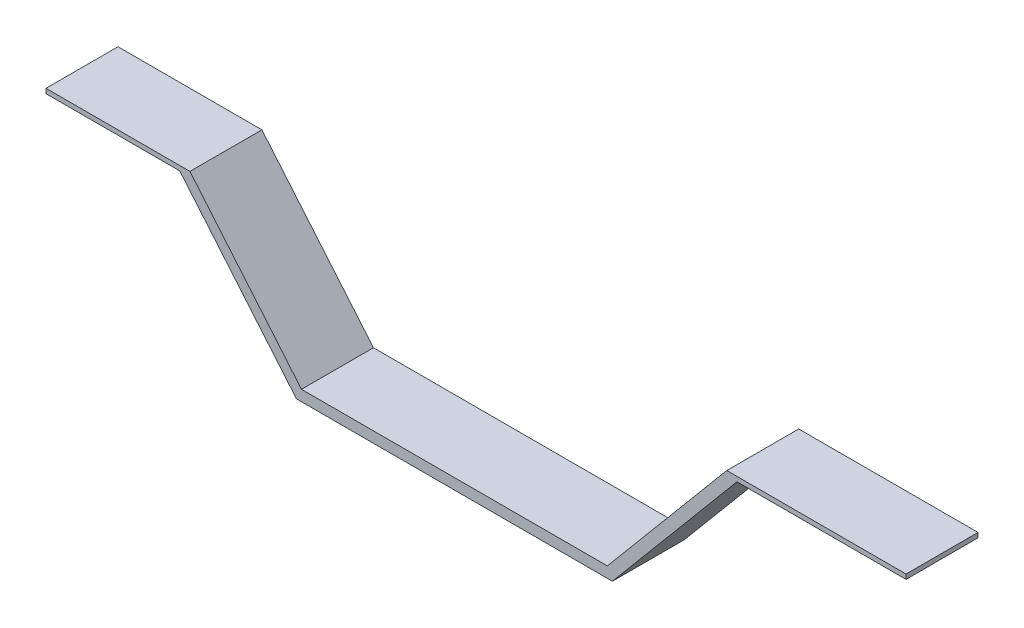
ISO-10303-21;
HEADER;
FILE_DESCRIPTION(('STEP AP214'),'2;1');
FILE_NAME('part.step','',(''),(''),'','','');
FILE_SCHEMA(('AUTOMOTIVE_DESIGN { 1 0 10303 214 1 1 1 1 }'));
ENDSEC;
DATA;
#1=APPLICATION_CONTEXT('core data for automotive mechanical design processes');
#2=APPLICATION_PROTOCOL_DEFINITION('international standard','automotive_design',2000,#1);
#3=PRODUCT_CONTEXT('',#1,'mechanical');
#4=PRODUCT('Part','Part','',(#3));
#5=PRODUCT_RELATED_PRODUCT_CATEGORY('part','',(#4));
#6=PRODUCT_DEFINITION_FORMATION('','',#4);
#7=PRODUCT_DEFINITION_CONTEXT('part definition',#1,'design');
#8=PRODUCT_DEFINITION('design','',#6,#7);
#9=PRODUCT_DEFINITION_SHAPE('','',#8);
#10=(LENGTH_UNIT() NAMED_UNIT(*) SI_UNIT(.MILLI.,.METRE.));
#11=(NAMED_UNIT(*) PLANE_ANGLE_UNIT() SI_UNIT($,.RADIAN.));
#12=(NAMED_UNIT(*) SI_UNIT($,.STERADIAN.) SOLID_ANGLE_UNIT());
#13=UNCERTAINTY_MEASURE_WITH_UNIT(LENGTH_MEASURE(1.E-05),#10,'distance_accuracy_value','');
#14=(GEOMETRIC_REPRESENTATION_CONTEXT(3) GLOBAL_UNCERTAINTY_ASSIGNED_CONTEXT((#13)) GLOBAL_UNIT_ASSIGNED_CONTEXT((#10,
#11,#12)) REPRESENTATION_CONTEXT('',''));
#15=CARTESIAN_POINT('',(0.,0.,0.));
#16=DIRECTION('',(0.,0.,1.));
#17=DIRECTION('',(1.,0.,0.));
#18=AXIS2_PLACEMENT_3D('',#15,#16,#17);
#19=CARTESIAN_POINT('',(-176.925616004308,29.5889707372712,20.));
#20=DIRECTION('',(1.,0.,0.));
#21=DIRECTION('',(0.,0.,-1.));
#22=AXIS2_PLACEMENT_3D('',#19,#20,#21);
#23=PLANE('',#22);
#24=DIRECTION('',(0.,-1.,0.));
#25=VECTOR('',#24,1.);
#26=CARTESIAN_POINT('',(-176.925616004308,29.5889707372712,0.));
#27=LINE('',#26,#25);
#28=CARTESIAN_POINT('',(-176.925616004308,29.5889707372712,0.));
#29=VERTEX_POINT('',#28);
#30=CARTESIAN_POINT('',(-176.925616004308,28.2889707372712,0.));
#31=VERTEX_POINT('',#30);
#32=EDGE_CURVE('E153',#29,#31,#27,.T.);
#33=ORIENTED_EDGE('',*,*,#32,.T.);
#34=DIRECTION('',(0.,0.,-1.));
#35=VECTOR('',#34,1.);
#36=CARTESIAN_POINT('',(-176.925616004308,28.2889707372712,20.));
#37=LINE('',#36,#35);
#38=CARTESIAN_POINT('',(-176.925616004308,28.2889707372712,20.));
#39=VERTEX_POINT('',#38);
#40=EDGE_CURVE('E11',#39,#31,#37,.T.);
#41=ORIENTED_EDGE('',*,*,#40,.F.);
#42=DIRECTION('',(0.,-1.,0.));
#43=VECTOR('',#42,1.);
#44=CARTESIAN_POINT('',(-176.925616004308,29.5889707372712,20.));
#45=LINE('',#44,#43);
#46=CARTESIAN_POINT('',(-176.925616004308,29.5889707372712,20.));
#47=VERTEX_POINT('',#46);
#48=EDGE_CURVE('E175',#47,#39,#45,.T.);
#49=ORIENTED_EDGE('',*,*,#48,.F.);
#50=DIRECTION('',(0.,0.,-1.));
#51=VECTOR('',#50,1.);
#52=CARTESIAN_POINT('',(-176.925616004308,29.5889707372712,20.));
#53=LINE('',#52,#51);
#54=EDGE_CURVE('E149',#47,#29,#53,.T.);
#55=ORIENTED_EDGE('',*,*,#54,.T.);
#56=EDGE_LOOP('',(#33,#41,#49,#55));
#57=FACE_BOUND('',#56,.T.);
#58=ADVANCED_FACE('F33',(#57),#23,.F.);
#59=CARTESIAN_POINT('',(-176.925616004308,28.2889707372712,20.));
#60=DIRECTION('',(0.,1.,0.));
#61=DIRECTION('',(0.,0.,1.));
#62=AXIS2_PLACEMENT_3D('',#59,#60,#61);
#63=PLANE('',#62);
#64=DIRECTION('',(1.,0.,0.));
#65=VECTOR('',#64,1.);
#66=CARTESIAN_POINT('',(-176.925616004308,28.2889707372712,0.));
#67=LINE('',#66,#65);
#68=CARTESIAN_POINT('',(-139.751008351775,28.2889707372712,0.));
#69=VERTEX_POINT('',#68);
#70=EDGE_CURVE('E156',#31,#69,#67,.T.);
#71=ORIENTED_EDGE('',*,*,#70,.T.);
#72=DIRECTION('',(0.,0.,-1.));
#73=VECTOR('',#72,1.);
#74=CARTESIAN_POINT('',(-139.751008351775,28.2889707372712,20.));
#75=LINE('',#74,#73);
#76=CARTESIAN_POINT('',(-139.751008351775,28.2889707372712,20.));
#77=VERTEX_POINT('',#76);
#78=EDGE_CURVE('E41',#77,#69,#75,.T.);
#79=ORIENTED_EDGE('',*,*,#78,.F.);
#80=DIRECTION('',(1.,0.,0.));
#81=VECTOR('',#80,1.);
#82=CARTESIAN_POINT('',(-176.925616004308,28.2889707372712,20.));
#83=LINE('',#82,#81);
#84=EDGE_CURVE('E104',#39,#77,#83,.T.);
#85=ORIENTED_EDGE('',*,*,#84,.F.);
#86=ORIENTED_EDGE('',*,*,#40,.T.);
#87=EDGE_LOOP('',(#71,#79,#85,#86));
#88=FACE_BOUND('',#87,.T.);
#89=ADVANCED_FACE('F253',(#88),#63,.F.);
#90=CARTESIAN_POINT('',(-139.751008351775,28.2889707372712,20.));
#91=DIRECTION('',(0.766044443118979,0.642787609686538,0.));
#92=DIRECTION('',(-0.642787609686538,0.766044443118979,0.));
#93=AXIS2_PLACEMENT_3D('',#90,#91,#92);
#94=PLANE('',#93);
#95=DIRECTION('',(0.642787609686538,-0.766044443118979,0.));
#96=VECTOR('',#95,1.);
#97=CARTESIAN_POINT('',(-139.751008351775,28.2889707372712,0.));
#98=LINE('',#97,#96);
#99=CARTESIAN_POINT('',(-107.324538978773,-10.3553906331496,0.));
#100=VERTEX_POINT('',#99);
#101=EDGE_CURVE('E158',#69,#100,#98,.T.);
#102=ORIENTED_EDGE('',*,*,#101,.T.);
#103=DIRECTION('',(0.,0.,-1.));
#104=VECTOR('',#103,1.);
#105=CARTESIAN_POINT('',(-107.324538978773,-10.3553906331496,20.));
#106=LINE('',#105,#104);
#107=CARTESIAN_POINT('',(-107.324538978773,-10.3553906331496,20.));
#108=VERTEX_POINT('',#107);
#109=EDGE_CURVE('E194',#108,#100,#106,.T.);
#110=ORIENTED_EDGE('',*,*,#109,.F.);
#111=DIRECTION('',(0.642787609686538,-0.766044443118979,0.));
#112=VECTOR('',#111,1.);
#113=CARTESIAN_POINT('',(-139.751008351775,28.2889707372712,20.));
#114=LINE('',#113,#112);
#115=EDGE_CURVE('E202',#77,#108,#114,.T.);
#116=ORIENTED_EDGE('',*,*,#115,.F.);
#117=ORIENTED_EDGE('',*,*,#78,.T.);
#118=EDGE_LOOP('',(#102,#110,#116,#117));
#119=FACE_BOUND('',#118,.T.);
#120=ADVANCED_FACE('F200',(#119),#94,.F.);
#121=CARTESIAN_POINT('',(-107.324538978773,-10.3553906331496,20.));
#122=DIRECTION('',(0.,1.,0.));
#123=DIRECTION('',(0.,0.,1.));
#124=AXIS2_PLACEMENT_3D('',#121,#122,#123);
#125=PLANE('',#124);
#126=DIRECTION('',(1.,0.,0.));
#127=VECTOR('',#126,1.);
#128=CARTESIAN_POINT('',(-107.324538978773,-10.3553906331496,0.));
#129=LINE('',#128,#127);
#130=CARTESIAN_POINT('',(-19.5266930298433,-10.3553906331496,0.));
#131=VERTEX_POINT('',#130);
#132=EDGE_CURVE('E160',#100,#131,#129,.T.);
#133=ORIENTED_EDGE('',*,*,#132,.T.);
#134=DIRECTION('',(0.,0.,-1.));
#135=VECTOR('',#134,1.);
#136=CARTESIAN_POINT('',(-19.5266930298433,-10.3553906331496,20.));
#137=LINE('',#136,#135);
#138=CARTESIAN_POINT('',(-19.5266930298433,-10.3553906331496,20.));
#139=VERTEX_POINT('',#138);
#140=EDGE_CURVE('E191',#139,#131,#137,.T.);
#141=ORIENTED_EDGE('',*,*,#140,.F.);
#142=DIRECTION('',(1.,0.,0.));
#143=VECTOR('',#142,1.);
#144=CARTESIAN_POINT('',(-107.324538978773,-10.3553906331496,20.));
#145=LINE('',#144,#143);
#146=EDGE_CURVE('E220',#108,#139,#145,.T.);
#147=ORIENTED_EDGE('',*,*,#146,.F.);
#148=ORIENTED_EDGE('',*,*,#109,.T.);
#149=EDGE_LOOP('',(#133,#141,#147,#148));
#150=FACE_BOUND('',#149,.T.);
#151=ADVANCED_FACE('F211',(#150),#125,.F.);
#152=CARTESIAN_POINT('',(-19.5266930298433,-10.3553906331496,20.));
#153=DIRECTION('',(-0.766044443118976,0.642787609686542,0.));
#154=DIRECTION('',(-0.642787609686542,-0.766044443118976,0.));
#155=AXIS2_PLACEMENT_3D('',#152,#153,#154);
#156=PLANE('',#155);
#157=DIRECTION('',(0.642787609686542,0.766044443118976,0.));
#158=VECTOR('',#157,1.);
#159=CARTESIAN_POINT('',(-19.5266930298433,-10.3553906331496,0.));
#160=LINE('',#159,#158);
#161=CARTESIAN_POINT('',(15.0850193793813,30.8932419763812,0.));
#162=VERTEX_POINT('',#161);
#163=EDGE_CURVE('E162',#131,#162,#160,.T.);
#164=ORIENTED_EDGE('',*,*,#163,.T.);
#165=DIRECTION('',(0.,0.,-1.));
#166=VECTOR('',#165,1.);
#167=CARTESIAN_POINT('',(15.0850193793813,30.8932419763812,20.));
#168=LINE('',#167,#166);
#169=CARTESIAN_POINT('',(15.0850193793813,30.8932419763812,20.));
#170=VERTEX_POINT('',#169);
#171=EDGE_CURVE('E188',#170,#162,#168,.T.);
#172=ORIENTED_EDGE('',*,*,#171,.F.);
#173=DIRECTION('',(0.642787609686542,0.766044443118976,0.));
#174=VECTOR('',#173,1.);
#175=CARTESIAN_POINT('',(-19.5266930298433,-10.3553906331496,20.));
#176=LINE('',#175,#174);
#177=EDGE_CURVE('E217',#139,#170,#176,.T.);
#178=ORIENTED_EDGE('',*,*,#177,.F.);
#179=ORIENTED_EDGE('',*,*,#140,.T.);
#180=EDGE_LOOP('',(#164,#172,#178,#179));
#181=FACE_BOUND('',#180,.T.);
#182=ADVANCED_FACE('F215',(#181),#156,.F.);
#183=CARTESIAN_POINT('',(62.0743839956915,30.8932419763812,20.));
#184=DIRECTION('',(0.,1.,0.));
#185=DIRECTION('',(0.,0.,1.));
#186=AXIS2_PLACEMENT_3D('',#183,#184,#185);
#187=PLANE('',#186);
#188=DIRECTION('',(1.,0.,0.));
#189=VECTOR('',#188,1.);
#190=CARTESIAN_POINT('',(62.0743839956915,30.8932419763812,0.));
#191=LINE('',#190,#189);
#192=CARTESIAN_POINT('',(62.0743839956915,30.8932419763812,0.));
#193=VERTEX_POINT('',#192);
#194=EDGE_CURVE('E164',#162,#193,#191,.T.);
#195=ORIENTED_EDGE('',*,*,#194,.T.);
#196=DIRECTION('',(0.,0.,-1.));
#197=VECTOR('',#196,1.);
#198=CARTESIAN_POINT('',(62.0743839956915,30.8932419763812,20.));
#199=LINE('',#198,#197);
#200=CARTESIAN_POINT('',(62.0743839956915,30.8932419763812,20.));
#201=VERTEX_POINT('',#200);
#202=EDGE_CURVE('E185',#201,#193,#199,.T.);
#203=ORIENTED_EDGE('',*,*,#202,.F.);
#204=DIRECTION('',(1.,0.,0.));
#205=VECTOR('',#204,1.);
#206=CARTESIAN_POINT('',(62.0743839956915,30.8932419763812,20.));
#207=LINE('',#206,#205);
#208=EDGE_CURVE('E219',#170,#201,#207,.T.);
#209=ORIENTED_EDGE('',*,*,#208,.F.);
#210=ORIENTED_EDGE('',*,*,#171,.T.);
#211=EDGE_LOOP('',(#195,#203,#209,#210));
#212=FACE_BOUND('',#211,.T.);
#213=ADVANCED_FACE('F266',(#212),#187,.F.);
#214=CARTESIAN_POINT('',(62.0743839956915,32.1932419763812,20.));
#215=DIRECTION('',(-1.,0.,0.));
#216=DIRECTION('',(0.,0.,1.));
#217=AXIS2_PLACEMENT_3D('',#214,#215,#216);
#218=PLANE('',#217);
#219=DIRECTION('',(0.,1.,0.));
#220=VECTOR('',#219,1.);
#221=CARTESIAN_POINT('',(62.0743839956915,32.1932419763812,0.));
#222=LINE('',#221,#220);
#223=CARTESIAN_POINT('',(62.0743839956915,32.1932419763812,0.));
#224=VERTEX_POINT('',#223);
#225=EDGE_CURVE('E166',#193,#224,#222,.T.);
#226=ORIENTED_EDGE('',*,*,#225,.T.);
#227=DIRECTION('',(0.,0.,-1.));
#228=VECTOR('',#227,1.);
#229=CARTESIAN_POINT('',(62.0743839956915,32.1932419763812,20.));
#230=LINE('',#229,#228);
#231=CARTESIAN_POINT('',(62.0743839956915,32.1932419763812,20.));
#232=VERTEX_POINT('',#231);
#233=EDGE_CURVE('E182',#232,#224,#230,.T.);
#234=ORIENTED_EDGE('',*,*,#233,.F.);
#235=DIRECTION('',(0.,1.,0.));
#236=VECTOR('',#235,1.);
#237=CARTESIAN_POINT('',(62.0743839956915,32.1932419763812,20.));
#238=LINE('',#237,#236);
#239=EDGE_CURVE('E222',#201,#232,#238,.T.);
#240=ORIENTED_EDGE('',*,*,#239,.F.);
#241=ORIENTED_EDGE('',*,*,#202,.T.);
#242=EDGE_LOOP('',(#226,#234,#240,#241));
#243=FACE_BOUND('',#242,.T.);
#244=ADVANCED_FACE('F269',(#243),#218,.F.);
#245=CARTESIAN_POINT('',(62.0743839956915,32.1932419763812,20.));
#246=DIRECTION('',(0.,-1.,0.));
#247=DIRECTION('',(0.,0.,-1.));
#248=AXIS2_PLACEMENT_3D('',#245,#246,#247);
#249=PLANE('',#248);
#250=DIRECTION('',(-1.,0.,0.));
#251=VECTOR('',#250,1.);
#252=CARTESIAN_POINT('',(62.0743839956915,32.1932419763812,0.));
#253=LINE('',#252,#251);
#254=CARTESIAN_POINT('',(12.2596270319149,32.1932419763812,0.));
#255=VERTEX_POINT('',#254);
#256=EDGE_CURVE('E168',#224,#255,#253,.T.);
#257=ORIENTED_EDGE('',*,*,#256,.T.);
#258=DIRECTION('',(0.,0.,-1.));
#259=VECTOR('',#258,1.);
#260=CARTESIAN_POINT('',(12.2596270319149,32.1932419763812,20.));
#261=LINE('',#260,#259);
#262=CARTESIAN_POINT('',(12.2596270319149,32.1932419763812,20.));
#263=VERTEX_POINT('',#262);
#264=EDGE_CURVE('E179',#263,#255,#261,.T.);
#265=ORIENTED_EDGE('',*,*,#264,.F.);
#266=DIRECTION('',(-1.,0.,0.));
#267=VECTOR('',#266,1.);
#268=CARTESIAN_POINT('',(62.0743839956915,32.1932419763812,20.));
#269=LINE('',#268,#267);
#270=EDGE_CURVE('E228',#232,#263,#269,.T.);
#271=ORIENTED_EDGE('',*,*,#270,.F.);
#272=ORIENTED_EDGE('',*,*,#233,.T.);
#273=EDGE_LOOP('',(#257,#265,#271,#272));
#274=FACE_BOUND('',#273,.T.);
#275=ADVANCED_FACE('F234',(#274),#249,.F.);
#276=CARTESIAN_POINT('',(-20.9256160043083,-7.35539063314961,20.));
#277=DIRECTION('',(0.766044443118976,-0.642787609686542,0.));
#278=DIRECTION('',(0.642787609686542,0.766044443118976,0.));
#279=AXIS2_PLACEMENT_3D('',#276,#277,#278);
#280=PLANE('',#279);
#281=DIRECTION('',(-0.642787609686542,-0.766044443118976,0.));
#282=VECTOR('',#281,1.);
#283=CARTESIAN_POINT('',(-20.9256160043083,-7.35539063314961,0.));
#284=LINE('',#283,#282);
#285=CARTESIAN_POINT('',(-20.9256160043083,-7.35539063314961,0.));
#286=VERTEX_POINT('',#285);
#287=EDGE_CURVE('E170',#255,#286,#284,.T.);
#288=ORIENTED_EDGE('',*,*,#287,.T.);
#289=DIRECTION('',(0.,0.,-1.));
#290=VECTOR('',#289,1.);
#291=CARTESIAN_POINT('',(-20.9256160043083,-7.35539063314961,20.));
#292=LINE('',#291,#290);
#293=CARTESIAN_POINT('',(-20.9256160043083,-7.35539063314961,20.));
#294=VERTEX_POINT('',#293);
#295=EDGE_CURVE('E144',#294,#286,#292,.T.);
#296=ORIENTED_EDGE('',*,*,#295,.F.);
#297=DIRECTION('',(-0.642787609686542,-0.766044443118976,0.));
#298=VECTOR('',#297,1.);
#299=CARTESIAN_POINT('',(-20.9256160043083,-7.35539063314961,20.));
#300=LINE('',#299,#298);
#301=EDGE_CURVE('E135',#263,#294,#300,.T.);
#302=ORIENTED_EDGE('',*,*,#301,.F.);
#303=ORIENTED_EDGE('',*,*,#264,.T.);
#304=EDGE_LOOP('',(#288,#296,#302,#303));
#305=FACE_BOUND('',#304,.T.);
#306=ADVANCED_FACE('F238',(#305),#280,.F.);
#307=CARTESIAN_POINT('',(-105.925616004308,-7.35539063314961,20.));
#308=DIRECTION('',(0.,-1.,0.));
#309=DIRECTION('',(0.,0.,-1.));
#310=AXIS2_PLACEMENT_3D('',#307,#308,#309);
#311=PLANE('',#310);
#312=DIRECTION('',(-1.,0.,0.));
#313=VECTOR('',#312,1.);
#314=CARTESIAN_POINT('',(-105.925616004308,-7.35539063314961,0.));
#315=LINE('',#314,#313);
#316=CARTESIAN_POINT('',(-105.925616004308,-7.35539063314961,0.));
#317=VERTEX_POINT('',#316);
#318=EDGE_CURVE('E143',#286,#317,#315,.T.);
#319=ORIENTED_EDGE('',*,*,#318,.T.);
#320=DIRECTION('',(0.,0.,-1.));
#321=VECTOR('',#320,1.);
#322=CARTESIAN_POINT('',(-105.925616004308,-7.35539063314961,20.));
#323=LINE('',#322,#321);
#324=CARTESIAN_POINT('',(-105.925616004308,-7.35539063314961,20.));
#325=VERTEX_POINT('',#324);
#326=EDGE_CURVE('E140',#325,#317,#323,.T.);
#327=ORIENTED_EDGE('',*,*,#326,.F.);
#328=DIRECTION('',(-1.,0.,0.));
#329=VECTOR('',#328,1.);
#330=CARTESIAN_POINT('',(-105.925616004308,-7.35539063314961,20.));
#331=LINE('',#330,#329);
#332=EDGE_CURVE('E129',#294,#325,#331,.T.);
#333=ORIENTED_EDGE('',*,*,#332,.F.);
#334=ORIENTED_EDGE('',*,*,#295,.T.);
#335=EDGE_LOOP('',(#319,#327,#333,#334));
#336=FACE_BOUND('',#335,.T.);
#337=ADVANCED_FACE('F141',(#336),#311,.F.);
#338=CARTESIAN_POINT('',(-136.925616004308,29.5889707372712,20.));
#339=DIRECTION('',(-0.766044443118979,-0.642787609686538,0.));
#340=DIRECTION('',(0.642787609686538,-0.766044443118979,0.));
#341=AXIS2_PLACEMENT_3D('',#338,#339,#340);
#342=PLANE('',#341);
#343=DIRECTION('',(-0.642787609686538,0.766044443118979,0.));
#344=VECTOR('',#343,1.);
#345=CARTESIAN_POINT('',(-136.925616004308,29.5889707372712,0.));
#346=LINE('',#345,#344);
#347=CARTESIAN_POINT('',(-136.925616004308,29.5889707372712,0.));
#348=VERTEX_POINT('',#347);
#349=EDGE_CURVE('E90',#317,#348,#346,.T.);
#350=ORIENTED_EDGE('',*,*,#349,.T.);
#351=DIRECTION('',(0.,0.,-1.));
#352=VECTOR('',#351,1.);
#353=CARTESIAN_POINT('',(-136.925616004308,29.5889707372712,20.));
#354=LINE('',#353,#352);
#355=CARTESIAN_POINT('',(-136.925616004308,29.5889707372712,20.));
#356=VERTEX_POINT('',#355);
#357=EDGE_CURVE('E145',#356,#348,#354,.T.);
#358=ORIENTED_EDGE('',*,*,#357,.F.);
#359=DIRECTION('',(-0.642787609686538,0.766044443118979,0.));
#360=VECTOR('',#359,1.);
#361=CARTESIAN_POINT('',(-136.925616004308,29.5889707372712,20.));
#362=LINE('',#361,#360);
#363=EDGE_CURVE('E133',#325,#356,#362,.T.);
#364=ORIENTED_EDGE('',*,*,#363,.F.);
#365=ORIENTED_EDGE('',*,*,#326,.T.);
#366=EDGE_LOOP('',(#350,#358,#364,#365));
#367=FACE_BOUND('',#366,.T.);
#368=ADVANCED_FACE('F147',(#367),#342,.F.);
#369=CARTESIAN_POINT('',(-176.925616004308,29.5889707372712,20.));
#370=DIRECTION('',(0.,-1.,0.));
#371=DIRECTION('',(0.,0.,-1.));
#372=AXIS2_PLACEMENT_3D('',#369,#370,#371);
#373=PLANE('',#372);
#374=DIRECTION('',(-1.,0.,0.));
#375=VECTOR('',#374,1.);
#376=CARTESIAN_POINT('',(-176.925616004308,29.5889707372712,0.));
#377=LINE('',#376,#375);
#378=EDGE_CURVE('E96',#348,#29,#377,.T.);
#379=ORIENTED_EDGE('',*,*,#378,.T.);
#380=ORIENTED_EDGE('',*,*,#54,.F.);
#381=DIRECTION('',(-1.,0.,0.));
#382=VECTOR('',#381,1.);
#383=CARTESIAN_POINT('',(-176.925616004308,29.5889707372712,20.));
#384=LINE('',#383,#382);
#385=EDGE_CURVE('E49',#356,#47,#384,.T.);
#386=ORIENTED_EDGE('',*,*,#385,.F.);
#387=ORIENTED_EDGE('',*,*,#357,.T.);
#388=EDGE_LOOP('',(#379,#380,#386,#387));
#389=FACE_BOUND('',#388,.T.);
#390=ADVANCED_FACE('F242',(#389),#373,.F.);
#391=CARTESIAN_POINT('',(0.,0.,20.));
#392=DIRECTION('',(0.,0.,1.));
#393=DIRECTION('',(1.,0.,0.));
#394=AXIS2_PLACEMENT_3D('',#391,#392,#393);
#395=PLANE('',#394);
#396=ORIENTED_EDGE('',*,*,#48,.T.);
#397=ORIENTED_EDGE('',*,*,#84,.T.);
#398=ORIENTED_EDGE('',*,*,#115,.T.);
#399=ORIENTED_EDGE('',*,*,#146,.T.);
#400=ORIENTED_EDGE('',*,*,#177,.T.);
#401=ORIENTED_EDGE('',*,*,#208,.T.);
#402=ORIENTED_EDGE('',*,*,#239,.T.);
#403=ORIENTED_EDGE('',*,*,#270,.T.);
#404=ORIENTED_EDGE('',*,*,#301,.T.);
#405=ORIENTED_EDGE('',*,*,#332,.T.);
#406=ORIENTED_EDGE('',*,*,#363,.T.);
#407=ORIENTED_EDGE('',*,*,#385,.T.);
#408=EDGE_LOOP('',(#396,#397,#398,#399,#400,#401,#402,#403,#404,#405,#406,#407));
#409=FACE_BOUND('',#408,.T.);
#410=ADVANCED_FACE('F131',(#409),#395,.T.);
#411=CARTESIAN_POINT('',(0.,0.,0.));
#412=DIRECTION('',(0.,0.,1.));
#413=DIRECTION('',(1.,0.,0.));
#414=AXIS2_PLACEMENT_3D('',#411,#412,#413);
#415=PLANE('',#414);
#416=ORIENTED_EDGE('',*,*,#32,.F.);
#417=ORIENTED_EDGE('',*,*,#378,.F.);
#418=ORIENTED_EDGE('',*,*,#349,.F.);
#419=ORIENTED_EDGE('',*,*,#318,.F.);
#420=ORIENTED_EDGE('',*,*,#287,.F.);
#421=ORIENTED_EDGE('',*,*,#256,.F.);
#422=ORIENTED_EDGE('',*,*,#225,.F.);
#423=ORIENTED_EDGE('',*,*,#194,.F.);
#424=ORIENTED_EDGE('',*,*,#163,.F.);
#425=ORIENTED_EDGE('',*,*,#132,.F.);
#426=ORIENTED_EDGE('',*,*,#101,.F.);
#427=ORIENTED_EDGE('',*,*,#70,.F.);
#428=EDGE_LOOP('',(#416,#417,#418,#419,#420,#421,#422,#423,#424,#425,#426,#427));
#429=FACE_BOUND('',#428,.T.);
#430=ADVANCED_FACE('F206',(#429),#415,.F.);
#431=CLOSED_SHELL('',(#58,#89,#120,#151,#182,#213,#244,#275,#306,#337,#368,#390,#410,#430));
#432=MANIFOLD_SOLID_BREP('B2',#431);
#433=ADVANCED_BREP_SHAPE_REPRESENTATION('',(#18,#432),#14);
#434=SHAPE_DEFINITION_REPRESENTATION(#9,#433);
ENDSEC;
END-ISO-10303-21;
